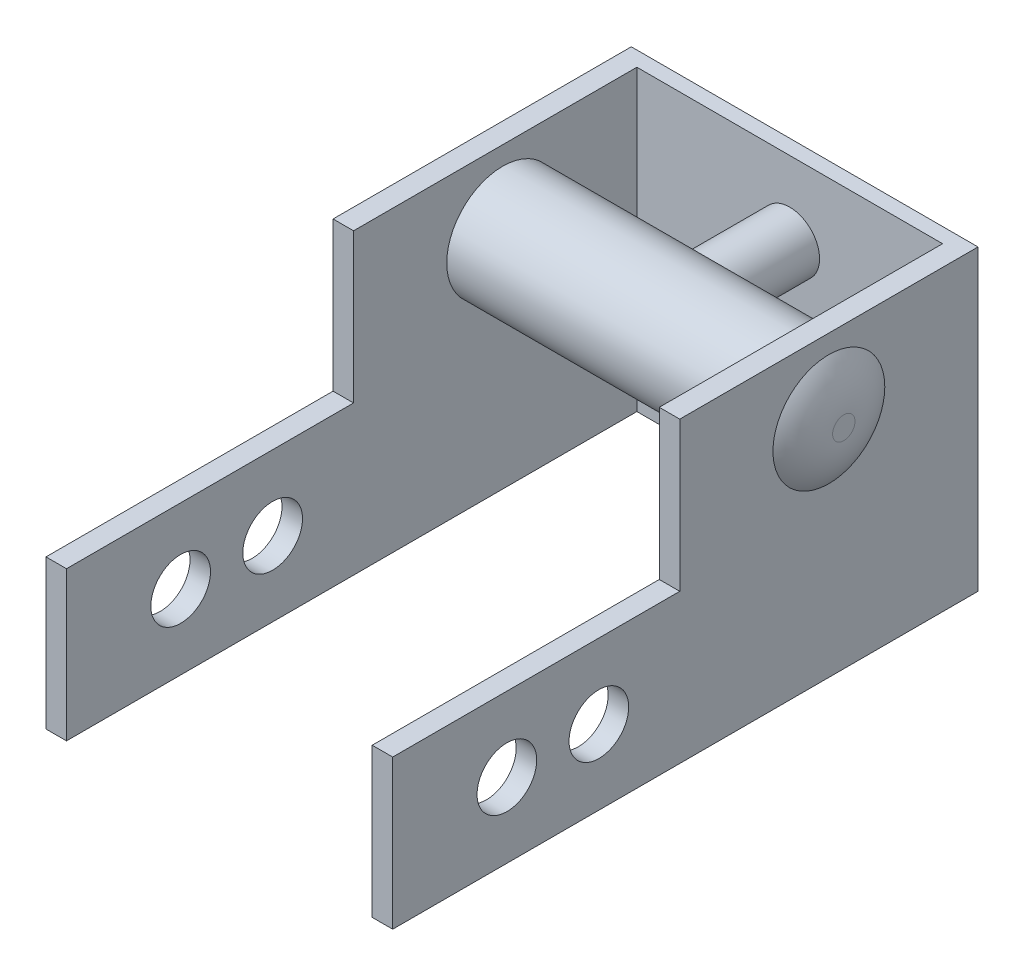
ISO-10303-21;
HEADER;
FILE_DESCRIPTION(('STEP AP214'),'2;1');
FILE_NAME('part.step','',(''),(''),'','','');
FILE_SCHEMA(('AUTOMOTIVE_DESIGN { 1 0 10303 214 1 1 1 1 }'));
ENDSEC;
DATA;
#1=APPLICATION_CONTEXT('core data for automotive mechanical design processes');
#2=APPLICATION_PROTOCOL_DEFINITION('international standard','automotive_design',2000,#1);
#3=PRODUCT_CONTEXT('',#1,'mechanical');
#4=PRODUCT('Part','Part','',(#3));
#5=PRODUCT_RELATED_PRODUCT_CATEGORY('part','',(#4));
#6=PRODUCT_DEFINITION_FORMATION('','',#4);
#7=PRODUCT_DEFINITION_CONTEXT('part definition',#1,'design');
#8=PRODUCT_DEFINITION('design','',#6,#7);
#9=PRODUCT_DEFINITION_SHAPE('','',#8);
#10=(LENGTH_UNIT() NAMED_UNIT(*) SI_UNIT(.MILLI.,.METRE.));
#11=(NAMED_UNIT(*) PLANE_ANGLE_UNIT() SI_UNIT($,.RADIAN.));
#12=(NAMED_UNIT(*) SI_UNIT($,.STERADIAN.) SOLID_ANGLE_UNIT());
#13=UNCERTAINTY_MEASURE_WITH_UNIT(LENGTH_MEASURE(1.E-05),#10,'distance_accuracy_value','');
#14=(GEOMETRIC_REPRESENTATION_CONTEXT(3) GLOBAL_UNCERTAINTY_ASSIGNED_CONTEXT((#13)) GLOBAL_UNIT_ASSIGNED_CONTEXT((#10,
#11,#12)) REPRESENTATION_CONTEXT('',''));
#15=CARTESIAN_POINT('',(0.,0.,0.));
#16=DIRECTION('',(0.,0.,1.));
#17=DIRECTION('',(1.,0.,0.));
#18=AXIS2_PLACEMENT_3D('',#15,#16,#17);
#19=CARTESIAN_POINT('',(46.5,30.9981155046301,18.6744004474786));
#20=DIRECTION('',(0.,0.,-1.));
#21=DIRECTION('',(0.,1.,0.));
#22=AXIS2_PLACEMENT_3D('',#19,#20,#21);
#23=PLANE('',#22);
#24=DIRECTION('',(0.,-1.,0.));
#25=VECTOR('',#24,1.);
#26=CARTESIAN_POINT('',(2.75,10.9981155046301,18.6744004474786));
#27=LINE('',#26,#25);
#28=CARTESIAN_POINT('',(2.75,30.9981155046301,18.6744004474786));
#29=VERTEX_POINT('',#28);
#30=CARTESIAN_POINT('',(2.75,10.9981155046301,18.6744004474786));
#31=VERTEX_POINT('',#30);
#32=EDGE_CURVE('E158',#29,#31,#27,.T.);
#33=ORIENTED_EDGE('',*,*,#32,.F.);
#34=DIRECTION('',(-1.,0.,0.));
#35=VECTOR('',#34,1.);
#36=CARTESIAN_POINT('',(46.5,30.9981155046301,18.6744004474786));
#37=LINE('',#36,#35);
#38=CARTESIAN_POINT('',(0.,30.9981155046301,18.6744004474786));
#39=VERTEX_POINT('',#38);
#40=EDGE_CURVE('E219',#29,#39,#37,.T.);
#41=ORIENTED_EDGE('',*,*,#40,.T.);
#42=DIRECTION('',(0.,-1.,0.));
#43=VECTOR('',#42,1.);
#44=CARTESIAN_POINT('',(0.,30.9981155046301,18.6744004474786));
#45=LINE('',#44,#43);
#46=CARTESIAN_POINT('',(0.,10.9981155046301,18.6744004474786));
#47=VERTEX_POINT('',#46);
#48=EDGE_CURVE('E202',#39,#47,#45,.T.);
#49=ORIENTED_EDGE('',*,*,#48,.T.);
#50=DIRECTION('',(-1.,0.,0.));
#51=VECTOR('',#50,1.);
#52=CARTESIAN_POINT('',(2.75,10.9981155046301,18.6744004474786));
#53=LINE('',#52,#51);
#54=EDGE_CURVE('E183',#31,#47,#53,.T.);
#55=ORIENTED_EDGE('',*,*,#54,.F.);
#56=EDGE_LOOP('',(#33,#41,#49,#55));
#57=FACE_BOUND('',#56,.T.);
#58=ADVANCED_FACE('F43',(#57),#23,.F.);
#59=DIRECTION('',(0.,1.,0.));
#60=VECTOR('',#59,1.);
#61=CARTESIAN_POINT('',(43.75,30.9981155046301,18.6744004474786));
#62=LINE('',#61,#60);
#63=CARTESIAN_POINT('',(43.75,10.9981155046301,18.6744004474786));
#64=VERTEX_POINT('',#63);
#65=CARTESIAN_POINT('',(43.75,30.9981155046301,18.6744004474786));
#66=VERTEX_POINT('',#65);
#67=EDGE_CURVE('E170',#64,#66,#62,.T.);
#68=ORIENTED_EDGE('',*,*,#67,.F.);
#69=DIRECTION('',(1.,0.,0.));
#70=VECTOR('',#69,1.);
#71=CARTESIAN_POINT('',(43.75,10.9981155046301,18.6744004474786));
#72=LINE('',#71,#70);
#73=CARTESIAN_POINT('',(46.5,10.9981155046301,18.6744004474786));
#74=VERTEX_POINT('',#73);
#75=EDGE_CURVE('E200',#64,#74,#72,.T.);
#76=ORIENTED_EDGE('',*,*,#75,.T.);
#77=DIRECTION('',(0.,-1.,0.));
#78=VECTOR('',#77,1.);
#79=CARTESIAN_POINT('',(46.5,30.9981155046301,18.6744004474786));
#80=LINE('',#79,#78);
#81=CARTESIAN_POINT('',(46.5,30.9981155046301,18.6744004474786));
#82=VERTEX_POINT('',#81);
#83=EDGE_CURVE('E206',#82,#74,#80,.T.);
#84=ORIENTED_EDGE('',*,*,#83,.F.);
#85=EDGE_CURVE('E227',#82,#66,#37,.T.);
#86=ORIENTED_EDGE('',*,*,#85,.T.);
#87=EDGE_LOOP('',(#68,#76,#84,#86));
#88=FACE_BOUND('',#87,.T.);
#89=ADVANCED_FACE('F292',(#88),#23,.F.);
#90=CARTESIAN_POINT('',(46.5,-9.00188449536991,18.6744004474786));
#91=DIRECTION('',(0.,1.,0.));
#92=DIRECTION('',(0.,0.,1.));
#93=AXIS2_PLACEMENT_3D('',#90,#91,#92);
#94=PLANE('',#93);
#95=DIRECTION('',(1.,0.,0.));
#96=VECTOR('',#95,1.);
#97=CARTESIAN_POINT('',(2.75,-9.00188449536991,-19.3255995525214));
#98=LINE('',#97,#96);
#99=CARTESIAN_POINT('',(2.75,-9.00188449536991,-19.3255995525214));
#100=VERTEX_POINT('',#99);
#101=CARTESIAN_POINT('',(43.75,-9.00188449536991,-19.3255995525214));
#102=VERTEX_POINT('',#101);
#103=EDGE_CURVE('E155',#100,#102,#98,.T.);
#104=ORIENTED_EDGE('',*,*,#103,.F.);
#105=DIRECTION('',(0.,0.,1.));
#106=VECTOR('',#105,1.);
#107=CARTESIAN_POINT('',(2.75,-9.00188449536991,57.1744004474786));
#108=LINE('',#107,#106);
#109=CARTESIAN_POINT('',(2.75,-9.00188449536991,57.1744004474786));
#110=VERTEX_POINT('',#109);
#111=EDGE_CURVE('E138',#100,#110,#108,.T.);
#112=ORIENTED_EDGE('',*,*,#111,.T.);
#113=DIRECTION('',(-1.,0.,0.));
#114=VECTOR('',#113,1.);
#115=CARTESIAN_POINT('',(2.75,-9.00188449536991,57.1744004474786));
#116=LINE('',#115,#114);
#117=CARTESIAN_POINT('',(0.,-9.00188449536991,57.1744004474786));
#118=VERTEX_POINT('',#117);
#119=EDGE_CURVE('E177',#110,#118,#116,.T.);
#120=ORIENTED_EDGE('',*,*,#119,.T.);
#121=DIRECTION('',(0.,0.,-1.));
#122=VECTOR('',#121,1.);
#123=CARTESIAN_POINT('',(0.,-9.00188449536991,18.6744004474786));
#124=LINE('',#123,#122);
#125=CARTESIAN_POINT('',(0.,-9.00188449536991,-21.3255995525214));
#126=VERTEX_POINT('',#125);
#127=EDGE_CURVE('E223',#118,#126,#124,.T.);
#128=ORIENTED_EDGE('',*,*,#127,.T.);
#129=DIRECTION('',(-1.,0.,0.));
#130=VECTOR('',#129,1.);
#131=CARTESIAN_POINT('',(46.5,-9.00188449536991,-21.3255995525214));
#132=LINE('',#131,#130);
#133=CARTESIAN_POINT('',(46.5,-9.00188449536991,-21.3255995525214));
#134=VERTEX_POINT('',#133);
#135=EDGE_CURVE('E231',#134,#126,#132,.T.);
#136=ORIENTED_EDGE('',*,*,#135,.F.);
#137=DIRECTION('',(0.,0.,-1.));
#138=VECTOR('',#137,1.);
#139=CARTESIAN_POINT('',(46.5,-9.00188449536991,18.6744004474786));
#140=LINE('',#139,#138);
#141=CARTESIAN_POINT('',(46.5,-9.00188449536991,57.1744004474786));
#142=VERTEX_POINT('',#141);
#143=EDGE_CURVE('E212',#142,#134,#140,.T.);
#144=ORIENTED_EDGE('',*,*,#143,.F.);
#145=DIRECTION('',(1.,0.,0.));
#146=VECTOR('',#145,1.);
#147=CARTESIAN_POINT('',(43.75,-9.00188449536991,57.1744004474786));
#148=LINE('',#147,#146);
#149=CARTESIAN_POINT('',(43.75,-9.00188449536991,57.1744004474786));
#150=VERTEX_POINT('',#149);
#151=EDGE_CURVE('E203',#150,#142,#148,.T.);
#152=ORIENTED_EDGE('',*,*,#151,.F.);
#153=DIRECTION('',(0.,0.,-1.));
#154=VECTOR('',#153,1.);
#155=CARTESIAN_POINT('',(43.75,-9.00188449536991,18.6744004474786));
#156=LINE('',#155,#154);
#157=EDGE_CURVE('E159',#150,#102,#156,.T.);
#158=ORIENTED_EDGE('',*,*,#157,.T.);
#159=EDGE_LOOP('',(#104,#112,#120,#128,#136,#144,#152,#158));
#160=FACE_BOUND('',#159,.T.);
#161=ADVANCED_FACE('F156',(#160),#94,.F.);
#162=CARTESIAN_POINT('',(46.5,-9.00188449536991,-21.3255995525214));
#163=DIRECTION('',(0.,0.,1.));
#164=DIRECTION('',(1.,0.,0.));
#165=AXIS2_PLACEMENT_3D('',#162,#163,#164);
#166=PLANE('',#165);
#167=CARTESIAN_POINT('',(23.25,20.9981155046301,-21.3255995525214));
#168=DIRECTION('',(0.,0.,-1.));
#169=DIRECTION('',(-1.,0.,0.));
#170=AXIS2_PLACEMENT_3D('',#167,#168,#169);
#171=CIRCLE('',#170,6.);
#172=CARTESIAN_POINT('',(17.25,20.9981155046301,-21.3255995525214));
#173=VERTEX_POINT('',#172);
#174=EDGE_CURVE('E246',#173,#173,#171,.T.);
#175=ORIENTED_EDGE('',*,*,#174,.F.);
#176=EDGE_LOOP('',(#175));
#177=FACE_BOUND('',#176,.T.);
#178=DIRECTION('',(0.,1.,0.));
#179=VECTOR('',#178,1.);
#180=CARTESIAN_POINT('',(0.,-9.00188449536991,-21.3255995525214));
#181=LINE('',#180,#179);
#182=CARTESIAN_POINT('',(0.,30.9981155046301,-21.3255995525214));
#183=VERTEX_POINT('',#182);
#184=EDGE_CURVE('E221',#126,#183,#181,.T.);
#185=ORIENTED_EDGE('',*,*,#184,.T.);
#186=DIRECTION('',(-1.,0.,0.));
#187=VECTOR('',#186,1.);
#188=CARTESIAN_POINT('',(46.5,30.9981155046301,-21.3255995525214));
#189=LINE('',#188,#187);
#190=CARTESIAN_POINT('',(46.5,30.9981155046301,-21.3255995525214));
#191=VERTEX_POINT('',#190);
#192=EDGE_CURVE('E229',#191,#183,#189,.T.);
#193=ORIENTED_EDGE('',*,*,#192,.F.);
#194=DIRECTION('',(0.,1.,0.));
#195=VECTOR('',#194,1.);
#196=CARTESIAN_POINT('',(46.5,-9.00188449536991,-21.3255995525214));
#197=LINE('',#196,#195);
#198=EDGE_CURVE('E211',#134,#191,#197,.T.);
#199=ORIENTED_EDGE('',*,*,#198,.F.);
#200=ORIENTED_EDGE('',*,*,#135,.T.);
#201=EDGE_LOOP('',(#185,#193,#199,#200));
#202=FACE_BOUND('',#201,.T.);
#203=ADVANCED_FACE('F304',(#177,#202),#166,.F.);
#204=CARTESIAN_POINT('',(46.5,30.9981155046301,-21.3255995525214));
#205=DIRECTION('',(0.,-1.,0.));
#206=DIRECTION('',(0.,0.,-1.));
#207=AXIS2_PLACEMENT_3D('',#204,#205,#206);
#208=PLANE('',#207);
#209=DIRECTION('',(-1.,0.,0.));
#210=VECTOR('',#209,1.);
#211=CARTESIAN_POINT('',(2.75,30.9981155046301,-19.3255995525214));
#212=LINE('',#211,#210);
#213=CARTESIAN_POINT('',(43.75,30.9981155046301,-19.3255995525214));
#214=VERTEX_POINT('',#213);
#215=CARTESIAN_POINT('',(2.75,30.9981155046301,-19.3255995525214));
#216=VERTEX_POINT('',#215);
#217=EDGE_CURVE('E151',#214,#216,#212,.T.);
#218=ORIENTED_EDGE('',*,*,#217,.F.);
#219=DIRECTION('',(0.,0.,1.));
#220=VECTOR('',#219,1.);
#221=CARTESIAN_POINT('',(43.75,30.9981155046301,-19.3255995525214));
#222=LINE('',#221,#220);
#223=EDGE_CURVE('E58',#214,#66,#222,.T.);
#224=ORIENTED_EDGE('',*,*,#223,.T.);
#225=ORIENTED_EDGE('',*,*,#85,.F.);
#226=DIRECTION('',(0.,0.,1.));
#227=VECTOR('',#226,1.);
#228=CARTESIAN_POINT('',(46.5,30.9981155046301,-21.3255995525214));
#229=LINE('',#228,#227);
#230=EDGE_CURVE('E217',#191,#82,#229,.T.);
#231=ORIENTED_EDGE('',*,*,#230,.F.);
#232=ORIENTED_EDGE('',*,*,#192,.T.);
#233=DIRECTION('',(0.,0.,1.));
#234=VECTOR('',#233,1.);
#235=CARTESIAN_POINT('',(0.,30.9981155046301,-21.3255995525214));
#236=LINE('',#235,#234);
#237=EDGE_CURVE('E215',#183,#39,#236,.T.);
#238=ORIENTED_EDGE('',*,*,#237,.T.);
#239=ORIENTED_EDGE('',*,*,#40,.F.);
#240=DIRECTION('',(0.,0.,1.));
#241=VECTOR('',#240,1.);
#242=CARTESIAN_POINT('',(2.75,30.9981155046301,-19.3255995525214));
#243=LINE('',#242,#241);
#244=EDGE_CURVE('E171',#216,#29,#243,.T.);
#245=ORIENTED_EDGE('',*,*,#244,.F.);
#246=EDGE_LOOP('',(#218,#224,#225,#231,#232,#238,#239,#245));
#247=FACE_BOUND('',#246,.T.);
#248=ADVANCED_FACE('F283',(#247),#208,.F.);
#249=CARTESIAN_POINT('',(46.5,0.,0.));
#250=DIRECTION('',(1.,0.,0.));
#251=DIRECTION('',(0.,0.,-1.));
#252=AXIS2_PLACEMENT_3D('',#249,#250,#251);
#253=PLANE('',#252);
#254=CARTESIAN_POINT('',(46.5,0.99811550463009,41.863292436886));
#255=DIRECTION('',(1.,0.,0.));
#256=DIRECTION('',(0.,0.,-1.));
#257=AXIS2_PLACEMENT_3D('',#254,#255,#256);
#258=CIRCLE('',#257,4.);
#259=CARTESIAN_POINT('',(46.5,0.99811550463009,37.863292436886));
#260=VERTEX_POINT('',#259);
#261=EDGE_CURVE('E249',#260,#260,#258,.T.);
#262=ORIENTED_EDGE('',*,*,#261,.F.);
#263=EDGE_LOOP('',(#262));
#264=FACE_BOUND('',#263,.T.);
#265=CARTESIAN_POINT('',(46.5,0.99811550463009,29.5259911279243));
#266=DIRECTION('',(1.,0.,0.));
#267=DIRECTION('',(0.,0.,-1.));
#268=AXIS2_PLACEMENT_3D('',#265,#266,#267);
#269=CIRCLE('',#268,4.);
#270=CARTESIAN_POINT('',(46.5,0.99811550463009,25.5259911279243));
#271=VERTEX_POINT('',#270);
#272=EDGE_CURVE('E260',#271,#271,#269,.T.);
#273=ORIENTED_EDGE('',*,*,#272,.F.);
#274=EDGE_LOOP('',(#273));
#275=FACE_BOUND('',#274,.T.);
#276=CARTESIAN_POINT('',(46.5,20.9981155046301,-1.32559955252139));
#277=DIRECTION('',(1.,0.,0.));
#278=DIRECTION('',(0.,0.,-1.));
#279=AXIS2_PLACEMENT_3D('',#276,#277,#278);
#280=CIRCLE('',#279,7.5);
#281=CARTESIAN_POINT('',(46.5,20.9981155046301,-8.82559955252139));
#282=VERTEX_POINT('',#281);
#283=EDGE_CURVE('E242',#282,#282,#280,.T.);
#284=ORIENTED_EDGE('',*,*,#283,.F.);
#285=EDGE_LOOP('',(#284));
#286=FACE_BOUND('',#285,.T.);
#287=ORIENTED_EDGE('',*,*,#83,.T.);
#288=DIRECTION('',(0.,0.,1.));
#289=VECTOR('',#288,1.);
#290=CARTESIAN_POINT('',(46.5,10.9981155046301,57.1744004474786));
#291=LINE('',#290,#289);
#292=CARTESIAN_POINT('',(46.5,10.9981155046301,57.1744004474786));
#293=VERTEX_POINT('',#292);
#294=EDGE_CURVE('E69',#74,#293,#291,.T.);
#295=ORIENTED_EDGE('',*,*,#294,.T.);
#296=DIRECTION('',(0.,-1.,0.));
#297=VECTOR('',#296,1.);
#298=CARTESIAN_POINT('',(46.5,-9.00188449536991,57.1744004474786));
#299=LINE('',#298,#297);
#300=EDGE_CURVE('E194',#293,#142,#299,.T.);
#301=ORIENTED_EDGE('',*,*,#300,.T.);
#302=ORIENTED_EDGE('',*,*,#143,.T.);
#303=ORIENTED_EDGE('',*,*,#198,.T.);
#304=ORIENTED_EDGE('',*,*,#230,.T.);
#305=EDGE_LOOP('',(#287,#295,#301,#302,#303,#304));
#306=FACE_BOUND('',#305,.T.);
#307=ADVANCED_FACE('F282',(#264,#275,#286,#306),#253,.T.);
#308=CARTESIAN_POINT('',(0.,0.,0.));
#309=DIRECTION('',(1.,0.,0.));
#310=DIRECTION('',(0.,0.,-1.));
#311=AXIS2_PLACEMENT_3D('',#308,#309,#310);
#312=PLANE('',#311);
#313=CARTESIAN_POINT('',(0.,0.99811550463009,41.863292436886));
#314=DIRECTION('',(1.,0.,0.));
#315=DIRECTION('',(0.,0.,-1.));
#316=AXIS2_PLACEMENT_3D('',#313,#314,#315);
#317=CIRCLE('',#316,4.);
#318=CARTESIAN_POINT('',(0.,0.99811550463009,37.863292436886));
#319=VERTEX_POINT('',#318);
#320=EDGE_CURVE('E269',#319,#319,#317,.T.);
#321=ORIENTED_EDGE('',*,*,#320,.T.);
#322=EDGE_LOOP('',(#321));
#323=FACE_BOUND('',#322,.T.);
#324=CARTESIAN_POINT('',(0.,0.99811550463009,29.5259911279243));
#325=DIRECTION('',(1.,0.,0.));
#326=DIRECTION('',(0.,0.,-1.));
#327=AXIS2_PLACEMENT_3D('',#324,#325,#326);
#328=CIRCLE('',#327,4.);
#329=CARTESIAN_POINT('',(0.,0.99811550463009,25.5259911279243));
#330=VERTEX_POINT('',#329);
#331=EDGE_CURVE('E251',#330,#330,#328,.T.);
#332=ORIENTED_EDGE('',*,*,#331,.T.);
#333=EDGE_LOOP('',(#332));
#334=FACE_BOUND('',#333,.T.);
#335=CARTESIAN_POINT('',(0.,20.9981155046301,-1.32559955252139));
#336=DIRECTION('',(1.,0.,0.));
#337=DIRECTION('',(0.,0.,-1.));
#338=AXIS2_PLACEMENT_3D('',#335,#336,#337);
#339=CIRCLE('',#338,7.5);
#340=CARTESIAN_POINT('',(0.,20.9981155046301,-8.82559955252139));
#341=VERTEX_POINT('',#340);
#342=EDGE_CURVE('E169',#341,#341,#339,.T.);
#343=ORIENTED_EDGE('',*,*,#342,.T.);
#344=EDGE_LOOP('',(#343));
#345=FACE_BOUND('',#344,.T.);
#346=ORIENTED_EDGE('',*,*,#48,.F.);
#347=ORIENTED_EDGE('',*,*,#237,.F.);
#348=ORIENTED_EDGE('',*,*,#184,.F.);
#349=ORIENTED_EDGE('',*,*,#127,.F.);
#350=DIRECTION('',(0.,1.,0.));
#351=VECTOR('',#350,1.);
#352=CARTESIAN_POINT('',(0.,10.9981155046301,57.1744004474786));
#353=LINE('',#352,#351);
#354=CARTESIAN_POINT('',(0.,10.9981155046301,57.1744004474786));
#355=VERTEX_POINT('',#354);
#356=EDGE_CURVE('E173',#118,#355,#353,.T.);
#357=ORIENTED_EDGE('',*,*,#356,.T.);
#358=DIRECTION('',(0.,0.,-1.));
#359=VECTOR('',#358,1.);
#360=CARTESIAN_POINT('',(0.,10.9981155046301,18.6744004474786));
#361=LINE('',#360,#359);
#362=EDGE_CURVE('E150',#355,#47,#361,.T.);
#363=ORIENTED_EDGE('',*,*,#362,.T.);
#364=EDGE_LOOP('',(#346,#347,#348,#349,#357,#363));
#365=FACE_BOUND('',#364,.T.);
#366=ADVANCED_FACE('F281',(#323,#334,#345,#365),#312,.F.);
#367=CARTESIAN_POINT('',(43.75,-9.00188449536991,57.1744004474786));
#368=DIRECTION('',(0.,0.,1.));
#369=DIRECTION('',(1.,0.,0.));
#370=AXIS2_PLACEMENT_3D('',#367,#368,#369);
#371=PLANE('',#370);
#372=ORIENTED_EDGE('',*,*,#300,.F.);
#373=DIRECTION('',(1.,0.,0.));
#374=VECTOR('',#373,1.);
#375=CARTESIAN_POINT('',(43.75,10.9981155046301,57.1744004474786));
#376=LINE('',#375,#374);
#377=CARTESIAN_POINT('',(43.75,10.9981155046301,57.1744004474786));
#378=VERTEX_POINT('',#377);
#379=EDGE_CURVE('E204',#378,#293,#376,.T.);
#380=ORIENTED_EDGE('',*,*,#379,.F.);
#381=DIRECTION('',(0.,-1.,0.));
#382=VECTOR('',#381,1.);
#383=CARTESIAN_POINT('',(43.75,-9.00188449536991,57.1744004474786));
#384=LINE('',#383,#382);
#385=EDGE_CURVE('E195',#378,#150,#384,.T.);
#386=ORIENTED_EDGE('',*,*,#385,.T.);
#387=ORIENTED_EDGE('',*,*,#151,.T.);
#388=EDGE_LOOP('',(#372,#380,#386,#387));
#389=FACE_BOUND('',#388,.T.);
#390=ADVANCED_FACE('F299',(#389),#371,.T.);
#391=CARTESIAN_POINT('',(43.75,10.9981155046301,57.1744004474786));
#392=DIRECTION('',(0.,1.,0.));
#393=DIRECTION('',(0.,0.,1.));
#394=AXIS2_PLACEMENT_3D('',#391,#392,#393);
#395=PLANE('',#394);
#396=ORIENTED_EDGE('',*,*,#294,.F.);
#397=ORIENTED_EDGE('',*,*,#75,.F.);
#398=DIRECTION('',(0.,0.,1.));
#399=VECTOR('',#398,1.);
#400=CARTESIAN_POINT('',(43.75,10.9981155046301,57.1744004474786));
#401=LINE('',#400,#399);
#402=EDGE_CURVE('E186',#64,#378,#401,.T.);
#403=ORIENTED_EDGE('',*,*,#402,.T.);
#404=ORIENTED_EDGE('',*,*,#379,.T.);
#405=EDGE_LOOP('',(#396,#397,#403,#404));
#406=FACE_BOUND('',#405,.T.);
#407=ADVANCED_FACE('F295',(#406),#395,.T.);
#408=CARTESIAN_POINT('',(43.75,0.,0.));
#409=DIRECTION('',(-1.,0.,0.));
#410=DIRECTION('',(0.,0.,1.));
#411=AXIS2_PLACEMENT_3D('',#408,#409,#410);
#412=PLANE('',#411);
#413=CARTESIAN_POINT('',(43.75,0.99811550463009,41.863292436886));
#414=DIRECTION('',(-1.,0.,0.));
#415=DIRECTION('',(0.,0.,1.));
#416=AXIS2_PLACEMENT_3D('',#413,#414,#415);
#417=CIRCLE('',#416,4.);
#418=CARTESIAN_POINT('',(43.75,0.99811550463009,45.863292436886));
#419=VERTEX_POINT('',#418);
#420=EDGE_CURVE('E270',#419,#419,#417,.T.);
#421=ORIENTED_EDGE('',*,*,#420,.F.);
#422=EDGE_LOOP('',(#421));
#423=FACE_BOUND('',#422,.T.);
#424=CARTESIAN_POINT('',(43.75,0.99811550463009,29.5259911279243));
#425=DIRECTION('',(-1.,0.,0.));
#426=DIRECTION('',(0.,0.,1.));
#427=AXIS2_PLACEMENT_3D('',#424,#425,#426);
#428=CIRCLE('',#427,4.);
#429=CARTESIAN_POINT('',(43.75,0.99811550463009,33.5259911279243));
#430=VERTEX_POINT('',#429);
#431=EDGE_CURVE('E248',#430,#430,#428,.T.);
#432=ORIENTED_EDGE('',*,*,#431,.F.);
#433=EDGE_LOOP('',(#432));
#434=FACE_BOUND('',#433,.T.);
#435=CARTESIAN_POINT('',(43.75,20.9981155046301,-1.32559955252139));
#436=DIRECTION('',(-1.,0.,0.));
#437=DIRECTION('',(0.,0.,1.));
#438=AXIS2_PLACEMENT_3D('',#435,#436,#437);
#439=CIRCLE('',#438,7.5);
#440=CARTESIAN_POINT('',(43.75,20.9981155046301,6.17440044747861));
#441=VERTEX_POINT('',#440);
#442=EDGE_CURVE('E237',#441,#441,#439,.T.);
#443=ORIENTED_EDGE('',*,*,#442,.F.);
#444=EDGE_LOOP('',(#443));
#445=FACE_BOUND('',#444,.T.);
#446=ORIENTED_EDGE('',*,*,#402,.F.);
#447=ORIENTED_EDGE('',*,*,#67,.T.);
#448=ORIENTED_EDGE('',*,*,#223,.F.);
#449=DIRECTION('',(0.,1.,0.));
#450=VECTOR('',#449,1.);
#451=CARTESIAN_POINT('',(43.75,-9.00188449536991,-19.3255995525214));
#452=LINE('',#451,#450);
#453=EDGE_CURVE('E163',#102,#214,#452,.T.);
#454=ORIENTED_EDGE('',*,*,#453,.F.);
#455=ORIENTED_EDGE('',*,*,#157,.F.);
#456=ORIENTED_EDGE('',*,*,#385,.F.);
#457=EDGE_LOOP('',(#446,#447,#448,#454,#455,#456));
#458=FACE_BOUND('',#457,.T.);
#459=ADVANCED_FACE('F298',(#423,#434,#445,#458),#412,.T.);
#460=CARTESIAN_POINT('',(2.75,10.9981155046301,18.6744004474786));
#461=DIRECTION('',(0.,1.,0.));
#462=DIRECTION('',(0.,0.,1.));
#463=AXIS2_PLACEMENT_3D('',#460,#461,#462);
#464=PLANE('',#463);
#465=ORIENTED_EDGE('',*,*,#362,.F.);
#466=DIRECTION('',(-1.,0.,0.));
#467=VECTOR('',#466,1.);
#468=CARTESIAN_POINT('',(2.75,10.9981155046301,57.1744004474786));
#469=LINE('',#468,#467);
#470=CARTESIAN_POINT('',(2.75,10.9981155046301,57.1744004474786));
#471=VERTEX_POINT('',#470);
#472=EDGE_CURVE('E187',#471,#355,#469,.T.);
#473=ORIENTED_EDGE('',*,*,#472,.F.);
#474=DIRECTION('',(0.,0.,-1.));
#475=VECTOR('',#474,1.);
#476=CARTESIAN_POINT('',(2.75,10.9981155046301,18.6744004474786));
#477=LINE('',#476,#475);
#478=EDGE_CURVE('E176',#471,#31,#477,.T.);
#479=ORIENTED_EDGE('',*,*,#478,.T.);
#480=ORIENTED_EDGE('',*,*,#54,.T.);
#481=EDGE_LOOP('',(#465,#473,#479,#480));
#482=FACE_BOUND('',#481,.T.);
#483=ADVANCED_FACE('F314',(#482),#464,.T.);
#484=CARTESIAN_POINT('',(2.75,10.9981155046301,57.1744004474786));
#485=DIRECTION('',(0.,0.,1.));
#486=DIRECTION('',(1.,0.,0.));
#487=AXIS2_PLACEMENT_3D('',#484,#485,#486);
#488=PLANE('',#487);
#489=ORIENTED_EDGE('',*,*,#356,.F.);
#490=ORIENTED_EDGE('',*,*,#119,.F.);
#491=DIRECTION('',(0.,1.,0.));
#492=VECTOR('',#491,1.);
#493=CARTESIAN_POINT('',(2.75,10.9981155046301,57.1744004474786));
#494=LINE('',#493,#492);
#495=EDGE_CURVE('E141',#110,#471,#494,.T.);
#496=ORIENTED_EDGE('',*,*,#495,.T.);
#497=ORIENTED_EDGE('',*,*,#472,.T.);
#498=EDGE_LOOP('',(#489,#490,#496,#497));
#499=FACE_BOUND('',#498,.T.);
#500=ADVANCED_FACE('F316',(#499),#488,.T.);
#501=CARTESIAN_POINT('',(2.75,0.,0.));
#502=DIRECTION('',(1.,0.,0.));
#503=DIRECTION('',(0.,0.,-1.));
#504=AXIS2_PLACEMENT_3D('',#501,#502,#503);
#505=PLANE('',#504);
#506=CARTESIAN_POINT('',(2.75,0.99811550463009,41.863292436886));
#507=DIRECTION('',(1.,0.,0.));
#508=DIRECTION('',(0.,0.,-1.));
#509=AXIS2_PLACEMENT_3D('',#506,#507,#508);
#510=CIRCLE('',#509,4.);
#511=CARTESIAN_POINT('',(2.75,0.99811550463009,37.863292436886));
#512=VERTEX_POINT('',#511);
#513=EDGE_CURVE('E50',#512,#512,#510,.T.);
#514=ORIENTED_EDGE('',*,*,#513,.F.);
#515=EDGE_LOOP('',(#514));
#516=FACE_BOUND('',#515,.T.);
#517=CARTESIAN_POINT('',(2.75,0.99811550463009,29.5259911279243));
#518=DIRECTION('',(1.,0.,0.));
#519=DIRECTION('',(0.,0.,-1.));
#520=AXIS2_PLACEMENT_3D('',#517,#518,#519);
#521=CIRCLE('',#520,4.);
#522=CARTESIAN_POINT('',(2.75,0.99811550463009,25.5259911279243));
#523=VERTEX_POINT('',#522);
#524=EDGE_CURVE('E250',#523,#523,#521,.T.);
#525=ORIENTED_EDGE('',*,*,#524,.F.);
#526=EDGE_LOOP('',(#525));
#527=FACE_BOUND('',#526,.T.);
#528=CARTESIAN_POINT('',(2.75,20.9981155046301,-1.32559955252139));
#529=DIRECTION('',(1.,0.,0.));
#530=DIRECTION('',(0.,0.,-1.));
#531=AXIS2_PLACEMENT_3D('',#528,#529,#530);
#532=CIRCLE('',#531,7.5);
#533=CARTESIAN_POINT('',(2.75,20.9981155046301,-8.82559955252139));
#534=VERTEX_POINT('',#533);
#535=EDGE_CURVE('E236',#534,#534,#532,.T.);
#536=ORIENTED_EDGE('',*,*,#535,.F.);
#537=EDGE_LOOP('',(#536));
#538=FACE_BOUND('',#537,.T.);
#539=ORIENTED_EDGE('',*,*,#111,.F.);
#540=DIRECTION('',(0.,-1.,0.));
#541=VECTOR('',#540,1.);
#542=CARTESIAN_POINT('',(2.75,10.9981155046301,-19.3255995525214));
#543=LINE('',#542,#541);
#544=EDGE_CURVE('E137',#216,#100,#543,.T.);
#545=ORIENTED_EDGE('',*,*,#544,.F.);
#546=ORIENTED_EDGE('',*,*,#244,.T.);
#547=ORIENTED_EDGE('',*,*,#32,.T.);
#548=ORIENTED_EDGE('',*,*,#478,.F.);
#549=ORIENTED_EDGE('',*,*,#495,.F.);
#550=EDGE_LOOP('',(#539,#545,#546,#547,#548,#549));
#551=FACE_BOUND('',#550,.T.);
#552=ADVANCED_FACE('F136',(#516,#527,#538,#551),#505,.T.);
#553=CARTESIAN_POINT('',(0.,0.,-19.3255995525214));
#554=DIRECTION('',(0.,0.,1.));
#555=DIRECTION('',(1.,0.,0.));
#556=AXIS2_PLACEMENT_3D('',#553,#554,#555);
#557=PLANE('',#556);
#558=CARTESIAN_POINT('',(23.25,20.9981155046301,-19.3255995525214));
#559=DIRECTION('',(0.,0.,1.));
#560=DIRECTION('',(1.,0.,0.));
#561=AXIS2_PLACEMENT_3D('',#558,#559,#560);
#562=CIRCLE('',#561,4.);
#563=CARTESIAN_POINT('',(27.25,20.9981155046301,-19.3255995525214));
#564=VERTEX_POINT('',#563);
#565=EDGE_CURVE('E11',#564,#564,#562,.T.);
#566=ORIENTED_EDGE('',*,*,#565,.F.);
#567=EDGE_LOOP('',(#566));
#568=FACE_BOUND('',#567,.T.);
#569=ORIENTED_EDGE('',*,*,#544,.T.);
#570=ORIENTED_EDGE('',*,*,#103,.T.);
#571=ORIENTED_EDGE('',*,*,#453,.T.);
#572=ORIENTED_EDGE('',*,*,#217,.T.);
#573=EDGE_LOOP('',(#569,#570,#571,#572));
#574=FACE_BOUND('',#573,.T.);
#575=ADVANCED_FACE('F152',(#568,#574),#557,.T.);
#576=CARTESIAN_POINT('',(48.5,20.9981155046301,-1.32559955252139));
#577=DIRECTION('',(-1.,0.,0.));
#578=DIRECTION('',(0.,0.,1.));
#579=AXIS2_PLACEMENT_3D('',#576,#577,#578);
#580=CYLINDRICAL_SURFACE('',#579,7.5);
#581=CARTESIAN_POINT('',(19.25,20.9981155046301,-8.82559955252139));
#582=CARTESIAN_POINT('',(19.2499995953412,21.1024447866923,-8.82559990911019));
#583=CARTESIAN_POINT('',(19.2540860640936,21.2067684777806,-8.82341793985345));
#584=CARTESIAN_POINT('',(19.2703788855431,21.4146350373242,-8.81474748061224));
#585=CARTESIAN_POINT('',(19.2825880287883,21.5181776250631,-8.80825751061415));
#586=CARTESIAN_POINT('',(19.3149963889827,21.7237772604444,-8.79112449577615));
#587=CARTESIAN_POINT('',(19.3352045270775,21.825832517077,-8.7804768140896));
#588=CARTESIAN_POINT('',(19.3833618780494,22.0276252483525,-8.75530185496939));
#589=CARTESIAN_POINT('',(19.4113142538572,22.1273617578848,-8.74077299245621));
#590=CARTESIAN_POINT('',(19.5060727823261,22.4211903542029,-8.69201065642136));
#591=CARTESIAN_POINT('',(19.5839526713682,22.6109716090281,-8.65250681687921));
#592=CARTESIAN_POINT('',(19.7663191581702,22.9743243327088,-8.56298468134636));
#593=CARTESIAN_POINT('',(19.8708058766719,23.1478957279991,-8.51296633764101));
#594=CARTESIAN_POINT('',(20.1112586814753,23.4869438911099,-8.40299479397135));
#595=CARTESIAN_POINT('',(20.2488488977362,23.6511274658055,-8.34260346545167));
#596=CARTESIAN_POINT('',(20.5480048388249,23.9552838324911,-8.21995349008197));
#597=CARTESIAN_POINT('',(20.7095913306105,24.0952354240248,-8.15769326345404));
#598=CARTESIAN_POINT('',(21.0699368902957,24.3599045487414,-8.03169837149182));
#599=CARTESIAN_POINT('',(21.2707421684444,24.482068393647,-7.9683471565514));
#600=CARTESIAN_POINT('',(21.5876625675347,24.6382459455756,-7.88326545530542));
#601=CARTESIAN_POINT('',(21.6959595276609,24.6858049083366,-7.85655528464871));
#602=CARTESIAN_POINT('',(21.9171797186096,24.7713935328092,-7.80748228813804));
#603=CARTESIAN_POINT('',(22.030099990271,24.80942918234,-7.78511673258416));
#604=CARTESIAN_POINT('',(22.2526336337263,24.8733995048211,-7.74692944724373));
#605=CARTESIAN_POINT('',(22.3620188979367,24.8999375861782,-7.73078830184156));
#606=CARTESIAN_POINT('',(22.5832278247082,24.9437606741653,-7.70388676836998));
#607=CARTESIAN_POINT('',(22.6950500639736,24.9610509387584,-7.69312332297102));
#608=CARTESIAN_POINT('',(22.9200764161729,24.9860918963747,-7.67747046633627));
#609=CARTESIAN_POINT('',(23.0332793162819,24.9938504275538,-7.67257622879979));
#610=CARTESIAN_POINT('',(23.2600266947144,24.9997099856707,-7.66888380413414));
#611=CARTESIAN_POINT('',(23.373571129977,24.99781218295,-7.6700848782569));
#612=CARTESIAN_POINT('',(23.5838804951816,24.985345226333,-7.67792521555672));
#613=CARTESIAN_POINT('',(23.6807523658853,24.9760374245167,-7.68377321229783));
#614=CARTESIAN_POINT('',(23.8732296268744,24.9504597825025,-7.69970290952563));
#615=CARTESIAN_POINT('',(23.9688346180792,24.9341877998505,-7.70978591284806));
#616=CARTESIAN_POINT('',(24.252767259703,24.8751951381529,-7.74591438504885));
#617=CARTESIAN_POINT('',(24.4383396028422,24.8222899012189,-7.77784472769707));
#618=CARTESIAN_POINT('',(24.8017191654347,24.690063824138,-7.85441361976647));
#619=CARTESIAN_POINT('',(24.9792582803735,24.6101762469392,-7.89932154951152));
#620=CARTESIAN_POINT('',(25.3193408638363,24.4266971013587,-7.99685227986364));
#621=CARTESIAN_POINT('',(25.4818776423767,24.3230950289617,-8.04947849545892));
#622=CARTESIAN_POINT('',(25.8124270345221,24.0774661664592,-8.16582388682384));
#623=CARTESIAN_POINT('',(25.9777350195176,23.9320301853024,-8.23003680517804));
#624=CARTESIAN_POINT('',(26.2828954565059,23.6153391264337,-8.3561852103767));
#625=CARTESIAN_POINT('',(26.4227323745781,23.4440684086231,-8.41811928918678));
#626=CARTESIAN_POINT('',(26.6143593262106,23.1648830002454,-8.50650958448687));
#627=CARTESIAN_POINT('',(26.6766600418698,23.064982758204,-8.53596891748713));
#628=CARTESIAN_POINT('',(26.7925204701255,22.8594186909922,-8.59174485836633));
#629=CARTESIAN_POINT('',(26.8460839048356,22.7537573458034,-8.61806280319963));
#630=CARTESIAN_POINT('',(26.9438755428416,22.537392669841,-8.66677934651141));
#631=CARTESIAN_POINT('',(26.9881081384345,22.4266917413174,-8.68917978821962));
#632=CARTESIAN_POINT('',(27.0667074994684,22.2010332692884,-8.7293900822395));
#633=CARTESIAN_POINT('',(27.1010755764953,22.0860762939637,-8.74720054480234));
#634=CARTESIAN_POINT('',(27.1568260048867,21.8633774862208,-8.77628929186143));
#635=CARTESIAN_POINT('',(27.1790977786054,21.7559156389965,-8.78801076169875));
#636=CARTESIAN_POINT('',(27.2147649613307,21.5391344661186,-8.80685151397554));
#637=CARTESIAN_POINT('',(27.2281613054148,21.4298153373853,-8.81397128122896));
#638=CARTESIAN_POINT('',(27.2458858786158,21.2102879499625,-8.8234024022973));
#639=CARTESIAN_POINT('',(27.250218291936,21.1000801251214,-8.82571597480347));
#640=CARTESIAN_POINT('',(27.249764779599,20.8796932059033,-8.82547410173149));
#641=CARTESIAN_POINT('',(27.2449793749444,20.7695141102445,-8.82291893435867));
#642=CARTESIAN_POINT('',(27.227207667656,20.5601327023986,-8.81346504441424));
#643=CARTESIAN_POINT('',(27.2150074878218,20.4608441093056,-8.80698285768705));
#644=CARTESIAN_POINT('',(27.1832814279601,20.2637610852628,-8.79021798031079));
#645=CARTESIAN_POINT('',(27.1637532578062,20.1659671313678,-8.77993410158069));
#646=CARTESIAN_POINT('',(27.0944779528649,19.8758769785506,-8.74371306150162));
#647=CARTESIAN_POINT('',(27.034023689463,19.6866852191709,-8.71239741084936));
#648=CARTESIAN_POINT('',(26.8851208663478,19.3168342592616,-8.63722693646261));
#649=CARTESIAN_POINT('',(26.7960118486593,19.1365054545381,-8.59307891561791));
#650=CARTESIAN_POINT('',(26.5931262060138,18.7928131040589,-8.49627184178289));
#651=CARTESIAN_POINT('',(26.4793399549809,18.6294562155778,-8.44360946956701));
#652=CARTESIAN_POINT('',(26.2162721321446,18.3056638245856,-8.32798141255471));
#653=CARTESIAN_POINT('',(26.0644878086345,18.1474368963281,-8.26451688304704));
#654=CARTESIAN_POINT('',(25.7369496884729,17.8575704785608,-8.13823629540999));
#655=CARTESIAN_POINT('',(25.5611739357276,17.7259556204614,-8.07542088864542));
#656=CARTESIAN_POINT('',(25.1758124663867,17.4843970580517,-7.9530700968718));
#657=CARTESIAN_POINT('',(24.9647472742001,17.3765087376362,-7.89404020291427));
#658=CARTESIAN_POINT('',(24.6340855024602,17.2433227010618,-7.81822120676191));
#659=CARTESIAN_POINT('',(24.5215285772379,17.2037033839728,-7.79507025798032));
#660=CARTESIAN_POINT('',(24.2924168361734,17.1344824025741,-7.75397143286914));
#661=CARTESIAN_POINT('',(24.1758627362571,17.1048789545561,-7.73602263018034));
#662=CARTESIAN_POINT('',(23.9513767658991,17.0585856769815,-7.7076656280099));
#663=CARTESIAN_POINT('',(23.843717428456,17.0409155629245,-7.69669136066574));
#664=CARTESIAN_POINT('',(23.6269091641975,17.014415999875,-7.68015570426331));
#665=CARTESIAN_POINT('',(23.5177604471324,17.0055853187833,-7.67459356083012));
#666=CARTESIAN_POINT('',(23.2990176268845,16.9969199220112,-7.66913674701739));
#667=CARTESIAN_POINT('',(23.1894237998197,16.9970802908293,-7.66923897986352));
#668=CARTESIAN_POINT('',(22.9708027226522,17.0063693513762,-7.67508606127794));
#669=CARTESIAN_POINT('',(22.8617754356899,17.0154974521242,-7.6808305380178));
#670=CARTESIAN_POINT('',(22.5634050278048,17.0528413258982,-7.70413244565133));
#671=CARTESIAN_POINT('',(22.3755623492799,17.0902644554367,-7.72733381218601));
#672=CARTESIAN_POINT('',(22.0092933957211,17.190646413867,-7.78752865450164));
#673=CARTESIAN_POINT('',(21.8308706405998,17.2536147128797,-7.82452724478645));
#674=CARTESIAN_POINT('',(21.475487161589,17.4077138018346,-7.91098433835988));
#675=CARTESIAN_POINT('',(21.299361112175,17.5003975438235,-7.96109198234165));
#676=CARTESIAN_POINT('',(20.9639863698165,17.709761295945,-8.06729757861026));
#677=CARTESIAN_POINT('',(20.8047468346597,17.8264542267548,-8.1233987484982));
#678=CARTESIAN_POINT('',(20.4836399545793,18.1001886104688,-8.24496135816358));
#679=CARTESIAN_POINT('',(20.3247243856283,18.2606248414064,-8.31060291800092));
#680=CARTESIAN_POINT('',(20.0351205477205,18.6074002772216,-8.43674829386137));
#681=CARTESIAN_POINT('',(19.9044505523532,18.7937561235564,-8.49724876857174));
#682=CARTESIAN_POINT('',(19.731403340399,19.0920277908711,-8.5801087222716));
#683=CARTESIAN_POINT('',(19.6770268195042,19.1959749904367,-8.60668954647089));
#684=CARTESIAN_POINT('',(19.5773458567423,19.4089605871775,-8.65611848171542));
#685=CARTESIAN_POINT('',(19.5320369496819,19.517996445745,-8.67896842894215));
#686=CARTESIAN_POINT('',(19.451116195751,19.7401671049746,-8.72021313558278));
#687=CARTESIAN_POINT('',(19.4154848415121,19.853293131138,-8.7386168490155));
#688=CARTESIAN_POINT('',(19.3543071856946,20.0828687755528,-8.77044600909182));
#689=CARTESIAN_POINT('',(19.3287552926978,20.1993165125832,-8.78387421556576));
#690=CARTESIAN_POINT('',(19.2890532099888,20.429037367061,-8.80482608795374));
#691=CARTESIAN_POINT('',(19.274427754857,20.5422060301962,-8.81259545308424));
#692=CARTESIAN_POINT('',(19.2549013133163,20.7696238564815,-8.82298202091502));
#693=CARTESIAN_POINT('',(19.2500004431088,20.8838730325265,-8.82559916205013));
#694=CARTESIAN_POINT('',(19.25,20.9981155046301,-8.82559955252139));
#695=B_SPLINE_CURVE_WITH_KNOTS('',3,(#581,#582,#583,#584,#585,#586,#587,#588,#589,#590,#591,
#592,#593,#594,#595,#596,#597,#598,#599,#600,#601,#602,#603,#604,#605,#606,#607,#608,#609,#610,
#611,#612,#613,#614,#615,#616,#617,#618,#619,#620,#621,#622,#623,#624,#625,#626,#627,#628,#629,
#630,#631,#632,#633,#634,#635,#636,#637,#638,#639,#640,#641,#642,#643,#644,#645,#646,#647,#648,
#649,#650,#651,#652,#653,#654,#655,#656,#657,#658,#659,#660,#661,#662,#663,#664,#665,#666,#667,
#668,#669,#670,#671,#672,#673,#674,#675,#676,#677,#678,#679,#680,#681,#682,#683,#684,#685,#686,
#687,#688,#689,#690,#691,#692,#693,#694),.UNSPECIFIED.,.T.,.F.,(4,2,2,2,2,2,2,2,2,2,2,2,2,2,2,2,
2,2,2,2,2,2,2,2,2,2,2,2,2,2,2,2,2,2,2,2,2,2,2,2,2,2,2,2,2,2,2,2,2,2,2,2,2,2,2,2,4),(0.,
0.312875469479017,0.62585848299281,0.93919154922676,1.25265277726732,1.87635275152568,
2.50005555618564,3.16498046195741,3.83048419996534,4.55668682890167,4.92002643777439,
5.28313701854146,5.62376635161281,5.96420180913769,6.30435713124203,6.64447122771346,
6.93659372254512,7.22880615034371,7.81285364987976,8.41002203259997,9.0074554365876,
9.69267368662065,10.3783084384646,10.7419894504042,11.1055151259851,11.4688692957185,
11.832175131501,12.1628321135777,12.4934542534944,12.8239237338457,13.1543743313612,
13.4547461604999,13.7552119394292,14.3555858590257,14.9709302919497,15.5865151910734,
16.2683843198732,16.9508817080032,17.6793249173507,18.0434998556508,18.407609904506,
18.736085199439,19.0645147029146,19.3927646522842,19.720992971169,20.2969971418722,
20.8732150446114,21.4865540202388,22.1002239350291,22.8026614959087,23.5055521504617,
23.8659835722859,24.2262370666405,24.5857589036965,24.9450810204139,25.2876812883866,
25.6302856501472),.UNSPECIFIED.);
#696=CARTESIAN_POINT('',(19.25,20.9981155046301,-8.82559955252139));
#697=VERTEX_POINT('',#696);
#698=EDGE_CURVE('E55',#697,#697,#695,.T.);
#699=ORIENTED_EDGE('',*,*,#698,.F.);
#700=EDGE_LOOP('',(#699));
#701=FACE_BOUND('',#700,.T.);
#702=ORIENTED_EDGE('',*,*,#442,.T.);
#703=EDGE_LOOP('',(#702));
#704=FACE_BOUND('',#703,.T.);
#705=ORIENTED_EDGE('',*,*,#535,.T.);
#706=EDGE_LOOP('',(#705));
#707=FACE_BOUND('',#706,.T.);
#708=ADVANCED_FACE('F387',(#701,#704,#707),#580,.T.);
#709=CARTESIAN_POINT('',(48.5,20.9981155046301,-1.32559955252139));
#710=DIRECTION('',(-1.,0.,0.));
#711=DIRECTION('',(0.,0.,1.));
#712=AXIS2_PLACEMENT_3D('',#709,#710,#711);
#713=PLANE('',#712);
#714=CARTESIAN_POINT('',(48.5,20.9981155046301,-1.32559955252139));
#715=DIRECTION('',(-1.,0.,0.));
#716=DIRECTION('',(0.,0.,1.));
#717=AXIS2_PLACEMENT_3D('',#714,#715,#716);
#718=CIRCLE('',#717,1.5);
#719=CARTESIAN_POINT('',(48.5,20.9981155046301,0.174400447478609));
#720=VERTEX_POINT('',#719);
#721=EDGE_CURVE('E239',#720,#720,#718,.F.);
#722=ORIENTED_EDGE('',*,*,#721,.T.);
#723=EDGE_LOOP('',(#722));
#724=FACE_BOUND('',#723,.T.);
#725=ADVANCED_FACE('F399',(#724),#713,.F.);
#726=CARTESIAN_POINT('',(-2.,20.9981155046301,-1.32559955252139));
#727=DIRECTION('',(1.,0.,0.));
#728=DIRECTION('',(0.,0.,-1.));
#729=AXIS2_PLACEMENT_3D('',#726,#727,#728);
#730=PLANE('',#729);
#731=CARTESIAN_POINT('',(-2.,20.9981155046301,-1.32559955252139));
#732=DIRECTION('',(1.,0.,0.));
#733=DIRECTION('',(0.,0.,-1.));
#734=AXIS2_PLACEMENT_3D('',#731,#732,#733);
#735=CIRCLE('',#734,1.5);
#736=CARTESIAN_POINT('',(-2.,20.9981155046301,-2.82559955252139));
#737=VERTEX_POINT('',#736);
#738=EDGE_CURVE('E243',#737,#737,#735,.F.);
#739=ORIENTED_EDGE('',*,*,#738,.T.);
#740=EDGE_LOOP('',(#739));
#741=FACE_BOUND('',#740,.T.);
#742=ADVANCED_FACE('F342',(#741),#730,.F.);
#743=CARTESIAN_POINT('',(38.5,20.9981155046301,-1.32559955252139));
#744=DIRECTION('',(1.,0.,0.));
#745=DIRECTION('',(0.,0.,-1.));
#746=AXIS2_PLACEMENT_3D('',#743,#744,#745);
#747=DEGENERATE_TOROIDAL_SURFACE('',#746,1.5,10.,.T.);
#748=ORIENTED_EDGE('',*,*,#721,.F.);
#749=EDGE_LOOP('',(#748));
#750=FACE_BOUND('',#749,.T.);
#751=ORIENTED_EDGE('',*,*,#283,.T.);
#752=EDGE_LOOP('',(#751));
#753=FACE_BOUND('',#752,.T.);
#754=ADVANCED_FACE('F276',(#750,#753),#747,.T.);
#755=CARTESIAN_POINT('',(8.,20.9981155046301,-1.32559955252139));
#756=DIRECTION('',(-1.,0.,0.));
#757=DIRECTION('',(0.,0.,1.));
#758=AXIS2_PLACEMENT_3D('',#755,#756,#757);
#759=DEGENERATE_TOROIDAL_SURFACE('',#758,1.5,10.,.T.);
#760=ORIENTED_EDGE('',*,*,#738,.F.);
#761=EDGE_LOOP('',(#760));
#762=FACE_BOUND('',#761,.T.);
#763=ORIENTED_EDGE('',*,*,#342,.F.);
#764=EDGE_LOOP('',(#763));
#765=FACE_BOUND('',#764,.T.);
#766=ADVANCED_FACE('F338',(#762,#765),#759,.T.);
#767=CARTESIAN_POINT('',(-4.,0.99811550463009,29.5259911279243));
#768=DIRECTION('',(1.,0.,0.));
#769=DIRECTION('',(0.,0.,-1.));
#770=AXIS2_PLACEMENT_3D('',#767,#768,#769);
#771=CYLINDRICAL_SURFACE('',#770,4.);
#772=ORIENTED_EDGE('',*,*,#524,.T.);
#773=EDGE_LOOP('',(#772));
#774=FACE_BOUND('',#773,.T.);
#775=ORIENTED_EDGE('',*,*,#331,.F.);
#776=EDGE_LOOP('',(#775));
#777=FACE_BOUND('',#776,.T.);
#778=ADVANCED_FACE('F341',(#774,#777),#771,.F.);
#779=CARTESIAN_POINT('',(-4.,0.99811550463009,41.863292436886));
#780=DIRECTION('',(1.,0.,0.));
#781=DIRECTION('',(0.,0.,-1.));
#782=AXIS2_PLACEMENT_3D('',#779,#780,#781);
#783=CYLINDRICAL_SURFACE('',#782,4.);
#784=ORIENTED_EDGE('',*,*,#513,.T.);
#785=EDGE_LOOP('',(#784));
#786=FACE_BOUND('',#785,.T.);
#787=ORIENTED_EDGE('',*,*,#320,.F.);
#788=EDGE_LOOP('',(#787));
#789=FACE_BOUND('',#788,.T.);
#790=ADVANCED_FACE('F346',(#786,#789),#783,.F.);
#791=ORIENTED_EDGE('',*,*,#431,.T.);
#792=EDGE_LOOP('',(#791));
#793=FACE_BOUND('',#792,.T.);
#794=ORIENTED_EDGE('',*,*,#272,.T.);
#795=EDGE_LOOP('',(#794));
#796=FACE_BOUND('',#795,.T.);
#797=ADVANCED_FACE('F353',(#793,#796),#771,.F.);
#798=ORIENTED_EDGE('',*,*,#420,.T.);
#799=EDGE_LOOP('',(#798));
#800=FACE_BOUND('',#799,.T.);
#801=ORIENTED_EDGE('',*,*,#261,.T.);
#802=EDGE_LOOP('',(#801));
#803=FACE_BOUND('',#802,.T.);
#804=ADVANCED_FACE('F391',(#800,#803),#783,.F.);
#805=CARTESIAN_POINT('',(23.25,20.9981155046301,-7.3255995525214));
#806=DIRECTION('',(0.,0.,-1.));
#807=DIRECTION('',(-1.,0.,0.));
#808=AXIS2_PLACEMENT_3D('',#805,#806,#807);
#809=CYLINDRICAL_SURFACE('',#808,4.);
#810=ORIENTED_EDGE('',*,*,#565,.T.);
#811=EDGE_LOOP('',(#810));
#812=FACE_BOUND('',#811,.T.);
#813=ORIENTED_EDGE('',*,*,#698,.T.);
#814=EDGE_LOOP('',(#813));
#815=FACE_BOUND('',#814,.T.);
#816=ADVANCED_FACE('F388',(#812,#815),#809,.T.);
#817=CARTESIAN_POINT('',(23.25,20.9981155046301,-21.3255995525214));
#818=DIRECTION('',(0.,0.,-1.));
#819=DIRECTION('',(-1.,0.,0.));
#820=AXIS2_PLACEMENT_3D('',#817,#818,#819);
#821=SPHERICAL_SURFACE('',#820,6.);
#822=ORIENTED_EDGE('',*,*,#174,.T.);
#823=EDGE_LOOP('',(#822));
#824=FACE_BOUND('',#823,.T.);
#825=ADVANCED_FACE('F44',(#824),#821,.T.);
#826=CLOSED_SHELL('',(#58,#89,#161,#203,#248,#307,#366,#390,#407,#459,#483,#500,#552,#575,#708,
#725,#742,#754,#766,#778,#790,#797,#804,#816,#825));
#827=MANIFOLD_SOLID_BREP('B2',#826);
#828=ADVANCED_BREP_SHAPE_REPRESENTATION('',(#18,#827),#14);
#829=SHAPE_DEFINITION_REPRESENTATION(#9,#828);
ENDSEC;
END-ISO-10303-21;
